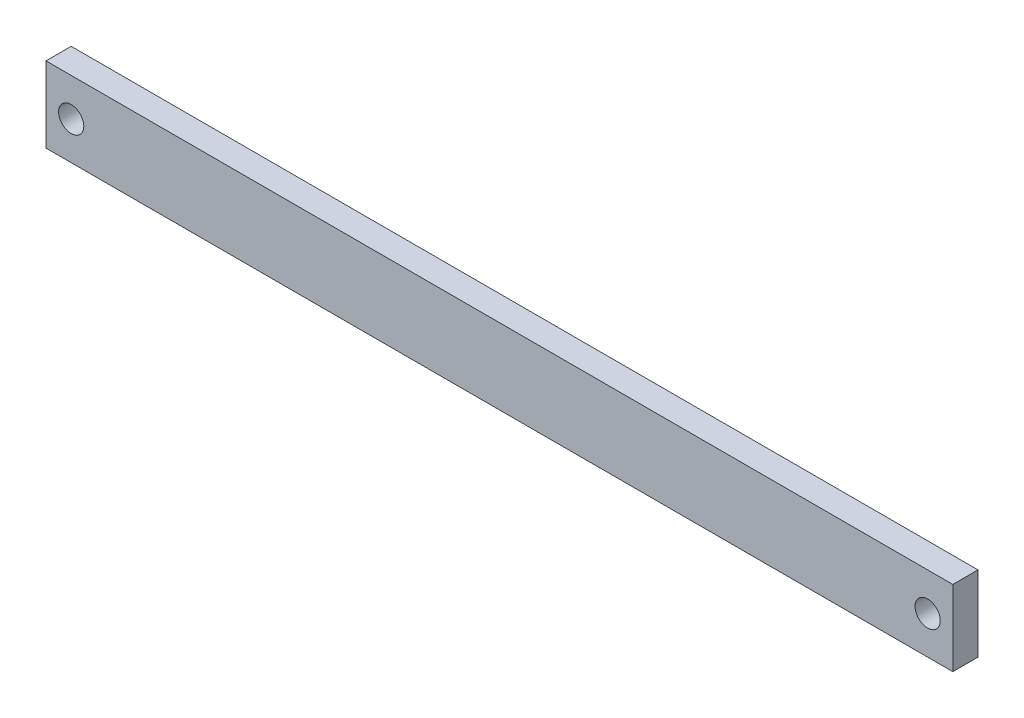
ISO-10303-21;
HEADER;
FILE_DESCRIPTION(('STEP AP214'),'2;1');
FILE_NAME('part.step','',(''),(''),'','','');
FILE_SCHEMA(('AUTOMOTIVE_DESIGN { 1 0 10303 214 1 1 1 1 }'));
ENDSEC;
DATA;
#1=APPLICATION_CONTEXT('core data for automotive mechanical design processes');
#2=APPLICATION_PROTOCOL_DEFINITION('international standard','automotive_design',2000,#1);
#3=PRODUCT_CONTEXT('',#1,'mechanical');
#4=PRODUCT('Part','Part','',(#3));
#5=PRODUCT_RELATED_PRODUCT_CATEGORY('part','',(#4));
#6=PRODUCT_DEFINITION_FORMATION('','',#4);
#7=PRODUCT_DEFINITION_CONTEXT('part definition',#1,'design');
#8=PRODUCT_DEFINITION('design','',#6,#7);
#9=PRODUCT_DEFINITION_SHAPE('','',#8);
#10=(LENGTH_UNIT() NAMED_UNIT(*) SI_UNIT(.MILLI.,.METRE.));
#11=(NAMED_UNIT(*) PLANE_ANGLE_UNIT() SI_UNIT($,.RADIAN.));
#12=(NAMED_UNIT(*) SI_UNIT($,.STERADIAN.) SOLID_ANGLE_UNIT());
#13=UNCERTAINTY_MEASURE_WITH_UNIT(LENGTH_MEASURE(1.E-05),#10,'distance_accuracy_value','');
#14=(GEOMETRIC_REPRESENTATION_CONTEXT(3) GLOBAL_UNCERTAINTY_ASSIGNED_CONTEXT((#13)) GLOBAL_UNIT_ASSIGNED_CONTEXT((#10,
#11,#12)) REPRESENTATION_CONTEXT('',''));
#15=CARTESIAN_POINT('',(0.,0.,0.));
#16=DIRECTION('',(0.,0.,1.));
#17=DIRECTION('',(1.,0.,0.));
#18=AXIS2_PLACEMENT_3D('',#15,#16,#17);
#19=CARTESIAN_POINT('',(0.,0.,5.));
#20=DIRECTION('',(0.,0.,-1.));
#21=DIRECTION('',(-1.,0.,0.));
#22=AXIS2_PLACEMENT_3D('',#19,#20,#21);
#23=PLANE('',#22);
#24=DIRECTION('',(0.,1.,0.));
#25=VECTOR('',#24,1.);
#26=CARTESIAN_POINT('',(90.,-7.5,5.));
#27=LINE('',#26,#25);
#28=CARTESIAN_POINT('',(90.,-7.5,5.));
#29=VERTEX_POINT('',#28);
#30=CARTESIAN_POINT('',(90.,7.5,5.));
#31=VERTEX_POINT('',#30);
#32=EDGE_CURVE('E91',#29,#31,#27,.T.);
#33=ORIENTED_EDGE('',*,*,#32,.T.);
#34=DIRECTION('',(-1.,0.,0.));
#35=VECTOR('',#34,1.);
#36=CARTESIAN_POINT('',(-90.,7.5,5.));
#37=LINE('',#36,#35);
#38=CARTESIAN_POINT('',(-90.,7.5,5.));
#39=VERTEX_POINT('',#38);
#40=EDGE_CURVE('E86',#31,#39,#37,.T.);
#41=ORIENTED_EDGE('',*,*,#40,.T.);
#42=DIRECTION('',(0.,-1.,0.));
#43=VECTOR('',#42,1.);
#44=CARTESIAN_POINT('',(-90.,-7.5,5.));
#45=LINE('',#44,#43);
#46=CARTESIAN_POINT('',(-90.,-7.5,5.));
#47=VERTEX_POINT('',#46);
#48=EDGE_CURVE('E89',#39,#47,#45,.T.);
#49=ORIENTED_EDGE('',*,*,#48,.T.);
#50=DIRECTION('',(1.,0.,0.));
#51=VECTOR('',#50,1.);
#52=CARTESIAN_POINT('',(-90.,-7.5,5.));
#53=LINE('',#52,#51);
#54=EDGE_CURVE('E56',#47,#29,#53,.T.);
#55=ORIENTED_EDGE('',*,*,#54,.T.);
#56=EDGE_LOOP('',(#33,#41,#49,#55));
#57=FACE_BOUND('',#56,.T.);
#58=CARTESIAN_POINT('',(85.,0.,5.));
#59=DIRECTION('',(0.,0.,1.));
#60=DIRECTION('',(1.,0.,0.));
#61=AXIS2_PLACEMENT_3D('',#58,#59,#60);
#62=CIRCLE('',#61,2.5);
#63=CARTESIAN_POINT('',(87.5,0.,5.));
#64=VERTEX_POINT('',#63);
#65=EDGE_CURVE('E106',#64,#64,#62,.T.);
#66=ORIENTED_EDGE('',*,*,#65,.F.);
#67=EDGE_LOOP('',(#66));
#68=FACE_BOUND('',#67,.T.);
#69=CARTESIAN_POINT('',(-85.,0.,5.));
#70=DIRECTION('',(0.,0.,1.));
#71=DIRECTION('',(1.,0.,0.));
#72=AXIS2_PLACEMENT_3D('',#69,#70,#71);
#73=CIRCLE('',#72,2.49999999999999);
#74=CARTESIAN_POINT('',(-82.5,0.,5.));
#75=VERTEX_POINT('',#74);
#76=EDGE_CURVE('E121',#75,#75,#73,.T.);
#77=ORIENTED_EDGE('',*,*,#76,.F.);
#78=EDGE_LOOP('',(#77));
#79=FACE_BOUND('',#78,.T.);
#80=ADVANCED_FACE('F39',(#57,#68,#79),#23,.F.);
#81=CARTESIAN_POINT('',(0.,0.,0.));
#82=DIRECTION('',(0.,0.,-1.));
#83=DIRECTION('',(-1.,0.,0.));
#84=AXIS2_PLACEMENT_3D('',#81,#82,#83);
#85=PLANE('',#84);
#86=CARTESIAN_POINT('',(85.,0.,0.));
#87=DIRECTION('',(0.,0.,1.));
#88=DIRECTION('',(1.,0.,0.));
#89=AXIS2_PLACEMENT_3D('',#86,#87,#88);
#90=CIRCLE('',#89,2.5);
#91=CARTESIAN_POINT('',(87.5,0.,0.));
#92=VERTEX_POINT('',#91);
#93=EDGE_CURVE('E118',#92,#92,#90,.T.);
#94=ORIENTED_EDGE('',*,*,#93,.T.);
#95=EDGE_LOOP('',(#94));
#96=FACE_BOUND('',#95,.T.);
#97=DIRECTION('',(0.,1.,0.));
#98=VECTOR('',#97,1.);
#99=CARTESIAN_POINT('',(90.,-7.5,0.));
#100=LINE('',#99,#98);
#101=CARTESIAN_POINT('',(90.,-7.5,0.));
#102=VERTEX_POINT('',#101);
#103=CARTESIAN_POINT('',(90.,7.5,0.));
#104=VERTEX_POINT('',#103);
#105=EDGE_CURVE('E103',#102,#104,#100,.T.);
#106=ORIENTED_EDGE('',*,*,#105,.F.);
#107=DIRECTION('',(1.,0.,0.));
#108=VECTOR('',#107,1.);
#109=CARTESIAN_POINT('',(-90.,-7.5,0.));
#110=LINE('',#109,#108);
#111=CARTESIAN_POINT('',(-90.,-7.5,0.));
#112=VERTEX_POINT('',#111);
#113=EDGE_CURVE('E79',#112,#102,#110,.T.);
#114=ORIENTED_EDGE('',*,*,#113,.F.);
#115=DIRECTION('',(0.,-1.,0.));
#116=VECTOR('',#115,1.);
#117=CARTESIAN_POINT('',(-90.,-7.5,0.));
#118=LINE('',#117,#116);
#119=CARTESIAN_POINT('',(-90.,7.5,0.));
#120=VERTEX_POINT('',#119);
#121=EDGE_CURVE('E73',#120,#112,#118,.T.);
#122=ORIENTED_EDGE('',*,*,#121,.F.);
#123=DIRECTION('',(-1.,0.,0.));
#124=VECTOR('',#123,1.);
#125=CARTESIAN_POINT('',(-90.,7.5,0.));
#126=LINE('',#125,#124);
#127=EDGE_CURVE('E95',#104,#120,#126,.T.);
#128=ORIENTED_EDGE('',*,*,#127,.F.);
#129=EDGE_LOOP('',(#106,#114,#122,#128));
#130=FACE_BOUND('',#129,.T.);
#131=CARTESIAN_POINT('',(-85.,0.,0.));
#132=DIRECTION('',(0.,0.,1.));
#133=DIRECTION('',(1.,0.,0.));
#134=AXIS2_PLACEMENT_3D('',#131,#132,#133);
#135=CIRCLE('',#134,2.49999999999999);
#136=CARTESIAN_POINT('',(-82.5,0.,0.));
#137=VERTEX_POINT('',#136);
#138=EDGE_CURVE('E124',#137,#137,#135,.T.);
#139=ORIENTED_EDGE('',*,*,#138,.T.);
#140=EDGE_LOOP('',(#139));
#141=FACE_BOUND('',#140,.T.);
#142=ADVANCED_FACE('F114',(#96,#130,#141),#85,.T.);
#143=CARTESIAN_POINT('',(90.,-7.5,5.));
#144=DIRECTION('',(-1.,0.,0.));
#145=DIRECTION('',(0.,0.,1.));
#146=AXIS2_PLACEMENT_3D('',#143,#144,#145);
#147=PLANE('',#146);
#148=ORIENTED_EDGE('',*,*,#105,.T.);
#149=DIRECTION('',(0.,0.,-1.));
#150=VECTOR('',#149,1.);
#151=CARTESIAN_POINT('',(90.,7.5,5.));
#152=LINE('',#151,#150);
#153=EDGE_CURVE('E11',#31,#104,#152,.T.);
#154=ORIENTED_EDGE('',*,*,#153,.F.);
#155=ORIENTED_EDGE('',*,*,#32,.F.);
#156=DIRECTION('',(0.,0.,-1.));
#157=VECTOR('',#156,1.);
#158=CARTESIAN_POINT('',(90.,-7.5,5.));
#159=LINE('',#158,#157);
#160=EDGE_CURVE('E99',#29,#102,#159,.T.);
#161=ORIENTED_EDGE('',*,*,#160,.T.);
#162=EDGE_LOOP('',(#148,#154,#155,#161));
#163=FACE_BOUND('',#162,.T.);
#164=ADVANCED_FACE('F41',(#163),#147,.F.);
#165=CARTESIAN_POINT('',(-90.,7.5,5.));
#166=DIRECTION('',(0.,-1.,0.));
#167=DIRECTION('',(0.,0.,-1.));
#168=AXIS2_PLACEMENT_3D('',#165,#166,#167);
#169=PLANE('',#168);
#170=ORIENTED_EDGE('',*,*,#127,.T.);
#171=DIRECTION('',(0.,0.,-1.));
#172=VECTOR('',#171,1.);
#173=CARTESIAN_POINT('',(-90.,7.5,5.));
#174=LINE('',#173,#172);
#175=EDGE_CURVE('E48',#39,#120,#174,.T.);
#176=ORIENTED_EDGE('',*,*,#175,.F.);
#177=ORIENTED_EDGE('',*,*,#40,.F.);
#178=ORIENTED_EDGE('',*,*,#153,.T.);
#179=EDGE_LOOP('',(#170,#176,#177,#178));
#180=FACE_BOUND('',#179,.T.);
#181=ADVANCED_FACE('F94',(#180),#169,.F.);
#182=CARTESIAN_POINT('',(-90.,-7.5,5.));
#183=DIRECTION('',(1.,0.,0.));
#184=DIRECTION('',(0.,0.,-1.));
#185=AXIS2_PLACEMENT_3D('',#182,#183,#184);
#186=PLANE('',#185);
#187=ORIENTED_EDGE('',*,*,#121,.T.);
#188=DIRECTION('',(0.,0.,-1.));
#189=VECTOR('',#188,1.);
#190=CARTESIAN_POINT('',(-90.,-7.5,5.));
#191=LINE('',#190,#189);
#192=EDGE_CURVE('E96',#47,#112,#191,.T.);
#193=ORIENTED_EDGE('',*,*,#192,.F.);
#194=ORIENTED_EDGE('',*,*,#48,.F.);
#195=ORIENTED_EDGE('',*,*,#175,.T.);
#196=EDGE_LOOP('',(#187,#193,#194,#195));
#197=FACE_BOUND('',#196,.T.);
#198=ADVANCED_FACE('F97',(#197),#186,.F.);
#199=CARTESIAN_POINT('',(-90.,-7.5,5.));
#200=DIRECTION('',(0.,1.,0.));
#201=DIRECTION('',(0.,0.,1.));
#202=AXIS2_PLACEMENT_3D('',#199,#200,#201);
#203=PLANE('',#202);
#204=ORIENTED_EDGE('',*,*,#113,.T.);
#205=ORIENTED_EDGE('',*,*,#160,.F.);
#206=ORIENTED_EDGE('',*,*,#54,.F.);
#207=ORIENTED_EDGE('',*,*,#192,.T.);
#208=EDGE_LOOP('',(#204,#205,#206,#207));
#209=FACE_BOUND('',#208,.T.);
#210=ADVANCED_FACE('F111',(#209),#203,.F.);
#211=CARTESIAN_POINT('',(85.,0.,5.));
#212=DIRECTION('',(0.,0.,-1.));
#213=DIRECTION('',(-1.,0.,0.));
#214=AXIS2_PLACEMENT_3D('',#211,#212,#213);
#215=CYLINDRICAL_SURFACE('',#214,2.5);
#216=ORIENTED_EDGE('',*,*,#65,.T.);
#217=EDGE_LOOP('',(#216));
#218=FACE_BOUND('',#217,.T.);
#219=ORIENTED_EDGE('',*,*,#93,.F.);
#220=EDGE_LOOP('',(#219));
#221=FACE_BOUND('',#220,.T.);
#222=ADVANCED_FACE('F141',(#218,#221),#215,.F.);
#223=CARTESIAN_POINT('',(-85.,0.,5.));
#224=DIRECTION('',(0.,0.,-1.));
#225=DIRECTION('',(-1.,0.,0.));
#226=AXIS2_PLACEMENT_3D('',#223,#224,#225);
#227=CYLINDRICAL_SURFACE('',#226,2.49999999999999);
#228=ORIENTED_EDGE('',*,*,#76,.T.);
#229=EDGE_LOOP('',(#228));
#230=FACE_BOUND('',#229,.T.);
#231=ORIENTED_EDGE('',*,*,#138,.F.);
#232=EDGE_LOOP('',(#231));
#233=FACE_BOUND('',#232,.T.);
#234=ADVANCED_FACE('F130',(#230,#233),#227,.F.);
#235=CLOSED_SHELL('',(#80,#142,#164,#181,#198,#210,#222,#234));
#236=MANIFOLD_SOLID_BREP('B2',#235);
#237=ADVANCED_BREP_SHAPE_REPRESENTATION('',(#18,#236),#14);
#238=SHAPE_DEFINITION_REPRESENTATION(#9,#237);
ENDSEC;
END-ISO-10303-21;
